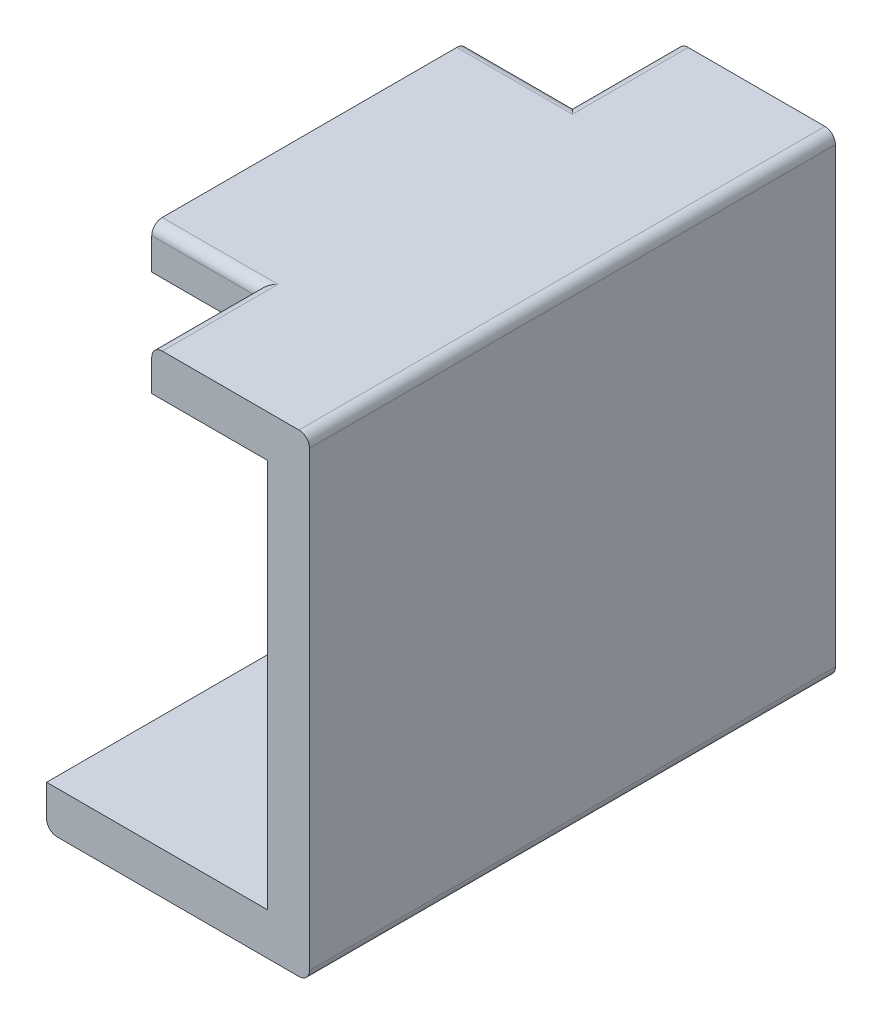
ISO-10303-21;
HEADER;
FILE_DESCRIPTION(('STEP AP214'),'2;1');
FILE_NAME('part.step','',(''),(''),'','','');
FILE_SCHEMA(('AUTOMOTIVE_DESIGN { 1 0 10303 214 1 1 1 1 }'));
ENDSEC;
DATA;
#1=APPLICATION_CONTEXT('core data for automotive mechanical design processes');
#2=APPLICATION_PROTOCOL_DEFINITION('international standard','automotive_design',2000,#1);
#3=PRODUCT_CONTEXT('',#1,'mechanical');
#4=PRODUCT('Part','Part','',(#3));
#5=PRODUCT_RELATED_PRODUCT_CATEGORY('part','',(#4));
#6=PRODUCT_DEFINITION_FORMATION('','',#4);
#7=PRODUCT_DEFINITION_CONTEXT('part definition',#1,'design');
#8=PRODUCT_DEFINITION('design','',#6,#7);
#9=PRODUCT_DEFINITION_SHAPE('','',#8);
#10=(LENGTH_UNIT() NAMED_UNIT(*) SI_UNIT(.MILLI.,.METRE.));
#11=(NAMED_UNIT(*) PLANE_ANGLE_UNIT() SI_UNIT($,.RADIAN.));
#12=(NAMED_UNIT(*) SI_UNIT($,.STERADIAN.) SOLID_ANGLE_UNIT());
#13=UNCERTAINTY_MEASURE_WITH_UNIT(LENGTH_MEASURE(1.E-05),#10,'distance_accuracy_value','');
#14=(GEOMETRIC_REPRESENTATION_CONTEXT(3) GLOBAL_UNCERTAINTY_ASSIGNED_CONTEXT((#13)) GLOBAL_UNIT_ASSIGNED_CONTEXT((#10,
#11,#12)) REPRESENTATION_CONTEXT('',''));
#15=CARTESIAN_POINT('',(0.,0.,0.));
#16=DIRECTION('',(0.,0.,1.));
#17=DIRECTION('',(1.,0.,0.));
#18=AXIS2_PLACEMENT_3D('',#15,#16,#17);
#19=CARTESIAN_POINT('',(4.568,3.4256,2.4852));
#20=DIRECTION('',(0.,-1.,0.));
#21=DIRECTION('',(0.,0.,-1.));
#22=AXIS2_PLACEMENT_3D('',#19,#20,#21);
#23=PLANE('',#22);
#24=DIRECTION('',(-1.,0.,0.));
#25=VECTOR('',#24,1.);
#26=CARTESIAN_POINT('',(4.568,3.4256,1.9852));
#27=LINE('',#26,#25);
#28=CARTESIAN_POINT('',(4.808,3.4256,1.9852));
#29=VERTEX_POINT('',#28);
#30=CARTESIAN_POINT('',(4.678,3.4256,1.9852));
#31=VERTEX_POINT('',#30);
#32=EDGE_CURVE('E11',#29,#31,#27,.T.);
#33=ORIENTED_EDGE('',*,*,#32,.T.);
#34=DIRECTION('',(0.,0.,1.));
#35=VECTOR('',#34,1.);
#36=CARTESIAN_POINT('',(4.678,3.4256,2.4852));
#37=LINE('',#36,#35);
#38=CARTESIAN_POINT('',(4.678,3.4256,2.0952));
#39=VERTEX_POINT('',#38);
#40=EDGE_CURVE('E24',#31,#39,#37,.T.);
#41=ORIENTED_EDGE('',*,*,#40,.T.);
#42=DIRECTION('',(-1.,0.,0.));
#43=VECTOR('',#42,1.);
#44=CARTESIAN_POINT('',(4.568,3.4256,2.0952));
#45=LINE('',#44,#43);
#46=CARTESIAN_POINT('',(4.568,3.4256,2.0952));
#47=VERTEX_POINT('',#46);
#48=EDGE_CURVE('E296',#39,#47,#45,.T.);
#49=ORIENTED_EDGE('',*,*,#48,.T.);
#50=DIRECTION('',(0.,0.,-1.));
#51=VECTOR('',#50,1.);
#52=CARTESIAN_POINT('',(4.568,3.4256,2.4852));
#53=LINE('',#52,#51);
#54=CARTESIAN_POINT('',(4.568,3.4256,2.3752));
#55=VERTEX_POINT('',#54);
#56=EDGE_CURVE('E293',#55,#47,#53,.T.);
#57=ORIENTED_EDGE('',*,*,#56,.F.);
#58=DIRECTION('',(1.,0.,0.));
#59=VECTOR('',#58,1.);
#60=CARTESIAN_POINT('',(4.568,3.4256,2.3752));
#61=LINE('',#60,#59);
#62=CARTESIAN_POINT('',(4.678,3.4256,2.3752));
#63=VERTEX_POINT('',#62);
#64=EDGE_CURVE('E291',#55,#63,#61,.T.);
#65=ORIENTED_EDGE('',*,*,#64,.T.);
#66=DIRECTION('',(0.,0.,1.));
#67=VECTOR('',#66,1.);
#68=CARTESIAN_POINT('',(4.678,3.4256,2.4852));
#69=LINE('',#68,#67);
#70=CARTESIAN_POINT('',(4.678,3.4256,2.4852));
#71=VERTEX_POINT('',#70);
#72=EDGE_CURVE('E173',#63,#71,#69,.T.);
#73=ORIENTED_EDGE('',*,*,#72,.T.);
#74=DIRECTION('',(-1.,0.,0.));
#75=VECTOR('',#74,1.);
#76=CARTESIAN_POINT('',(4.568,3.4256,2.4852));
#77=LINE('',#76,#75);
#78=CARTESIAN_POINT('',(4.808,3.4256,2.4852));
#79=VERTEX_POINT('',#78);
#80=EDGE_CURVE('E287',#79,#71,#77,.T.);
#81=ORIENTED_EDGE('',*,*,#80,.F.);
#82=DIRECTION('',(0.,0.,-1.));
#83=VECTOR('',#82,1.);
#84=CARTESIAN_POINT('',(4.808,3.4256,2.4852));
#85=LINE('',#84,#83);
#86=EDGE_CURVE('E285',#79,#29,#85,.T.);
#87=ORIENTED_EDGE('',*,*,#86,.T.);
#88=EDGE_LOOP('',(#33,#41,#49,#57,#65,#73,#81,#87));
#89=FACE_BOUND('',#88,.T.);
#90=ADVANCED_FACE('F17',(#89),#23,.F.);
#91=CARTESIAN_POINT('',(4.568,3.4256,2.4852));
#92=DIRECTION('',(1.,0.,0.));
#93=DIRECTION('',(0.,0.,-1.));
#94=AXIS2_PLACEMENT_3D('',#91,#92,#93);
#95=PLANE('',#94);
#96=ORIENTED_EDGE('',*,*,#56,.T.);
#97=CARTESIAN_POINT('',(4.568,3.4156,2.0952));
#98=DIRECTION('',(-1.,0.,0.));
#99=DIRECTION('',(0.,0.,-1.));
#100=AXIS2_PLACEMENT_3D('',#97,#98,#99);
#101=CIRCLE('',#100,0.01);
#102=CARTESIAN_POINT('',(4.568,3.4156,2.0852));
#103=VERTEX_POINT('',#102);
#104=EDGE_CURVE('E283',#47,#103,#101,.T.);
#105=ORIENTED_EDGE('',*,*,#104,.T.);
#106=DIRECTION('',(0.,-1.,0.));
#107=VECTOR('',#106,1.);
#108=CARTESIAN_POINT('',(4.568,3.4256,2.0852));
#109=LINE('',#108,#107);
#110=CARTESIAN_POINT('',(4.568,3.3856,2.0852));
#111=VERTEX_POINT('',#110);
#112=EDGE_CURVE('E281',#103,#111,#109,.T.);
#113=ORIENTED_EDGE('',*,*,#112,.T.);
#114=DIRECTION('',(0.,0.,-1.));
#115=VECTOR('',#114,1.);
#116=CARTESIAN_POINT('',(4.568,3.3856,2.4852));
#117=LINE('',#116,#115);
#118=CARTESIAN_POINT('',(4.568,3.3856,2.3852));
#119=VERTEX_POINT('',#118);
#120=EDGE_CURVE('E278',#119,#111,#117,.T.);
#121=ORIENTED_EDGE('',*,*,#120,.F.);
#122=DIRECTION('',(0.,1.,0.));
#123=VECTOR('',#122,1.);
#124=CARTESIAN_POINT('',(4.568,3.4256,2.3852));
#125=LINE('',#124,#123);
#126=CARTESIAN_POINT('',(4.568,3.4156,2.3852));
#127=VERTEX_POINT('',#126);
#128=EDGE_CURVE('E276',#119,#127,#125,.T.);
#129=ORIENTED_EDGE('',*,*,#128,.T.);
#130=CARTESIAN_POINT('',(4.568,3.4156,2.3752));
#131=DIRECTION('',(-1.,0.,0.));
#132=DIRECTION('',(0.,0.,-1.));
#133=AXIS2_PLACEMENT_3D('',#130,#131,#132);
#134=CIRCLE('',#133,0.01);
#135=EDGE_CURVE('E159',#127,#55,#134,.T.);
#136=ORIENTED_EDGE('',*,*,#135,.T.);
#137=EDGE_LOOP('',(#96,#105,#113,#121,#129,#136));
#138=FACE_BOUND('',#137,.T.);
#139=ADVANCED_FACE('F317',(#138),#95,.F.);
#140=CARTESIAN_POINT('',(4.778,3.3856,2.4852));
#141=DIRECTION('',(0.,1.,0.));
#142=DIRECTION('',(-1.,0.,0.));
#143=AXIS2_PLACEMENT_3D('',#140,#141,#142);
#144=PLANE('',#143);
#145=DIRECTION('',(1.,0.,0.));
#146=VECTOR('',#145,1.);
#147=CARTESIAN_POINT('',(3.968,3.3856,2.0852));
#148=LINE('',#147,#146);
#149=CARTESIAN_POINT('',(4.668,3.3856,2.0852));
#150=VERTEX_POINT('',#149);
#151=EDGE_CURVE('E273',#111,#150,#148,.T.);
#152=ORIENTED_EDGE('',*,*,#151,.T.);
#153=DIRECTION('',(0.,0.,-1.));
#154=VECTOR('',#153,1.);
#155=CARTESIAN_POINT('',(4.668,3.3856,1.9852));
#156=LINE('',#155,#154);
#157=CARTESIAN_POINT('',(4.668,3.3856,1.9852));
#158=VERTEX_POINT('',#157);
#159=EDGE_CURVE('E271',#150,#158,#156,.T.);
#160=ORIENTED_EDGE('',*,*,#159,.T.);
#161=DIRECTION('',(1.,0.,0.));
#162=VECTOR('',#161,1.);
#163=CARTESIAN_POINT('',(4.778,3.3856,1.9852));
#164=LINE('',#163,#162);
#165=CARTESIAN_POINT('',(4.778,3.3856,1.9852));
#166=VERTEX_POINT('',#165);
#167=EDGE_CURVE('E269',#158,#166,#164,.T.);
#168=ORIENTED_EDGE('',*,*,#167,.T.);
#169=DIRECTION('',(0.,0.,-1.));
#170=VECTOR('',#169,1.);
#171=CARTESIAN_POINT('',(4.778,3.3856,2.4852));
#172=LINE('',#171,#170);
#173=CARTESIAN_POINT('',(4.778,3.3856,2.4852));
#174=VERTEX_POINT('',#173);
#175=EDGE_CURVE('E266',#174,#166,#172,.T.);
#176=ORIENTED_EDGE('',*,*,#175,.F.);
#177=DIRECTION('',(1.,0.,0.));
#178=VECTOR('',#177,1.);
#179=CARTESIAN_POINT('',(4.778,3.3856,2.4852));
#180=LINE('',#179,#178);
#181=CARTESIAN_POINT('',(4.668,3.3856,2.4852));
#182=VERTEX_POINT('',#181);
#183=EDGE_CURVE('E263',#182,#174,#180,.T.);
#184=ORIENTED_EDGE('',*,*,#183,.F.);
#185=DIRECTION('',(0.,0.,-1.));
#186=VECTOR('',#185,1.);
#187=CARTESIAN_POINT('',(4.668,3.3856,2.4852));
#188=LINE('',#187,#186);
#189=CARTESIAN_POINT('',(4.668,3.3856,2.3852));
#190=VERTEX_POINT('',#189);
#191=EDGE_CURVE('E261',#182,#190,#188,.T.);
#192=ORIENTED_EDGE('',*,*,#191,.T.);
#193=DIRECTION('',(-1.,0.,0.));
#194=VECTOR('',#193,1.);
#195=CARTESIAN_POINT('',(3.968,3.3856,2.3852));
#196=LINE('',#195,#194);
#197=EDGE_CURVE('E145',#190,#119,#196,.T.);
#198=ORIENTED_EDGE('',*,*,#197,.T.);
#199=ORIENTED_EDGE('',*,*,#120,.T.);
#200=EDGE_LOOP('',(#152,#160,#168,#176,#184,#192,#198,#199));
#201=FACE_BOUND('',#200,.T.);
#202=ADVANCED_FACE('F319',(#201),#144,.F.);
#203=CARTESIAN_POINT('',(4.778,3.3856,2.4852));
#204=DIRECTION('',(1.,0.,0.));
#205=DIRECTION('',(0.,0.,-1.));
#206=AXIS2_PLACEMENT_3D('',#203,#204,#205);
#207=PLANE('',#206);
#208=DIRECTION('',(0.,-1.,0.));
#209=VECTOR('',#208,1.);
#210=CARTESIAN_POINT('',(4.778,3.3856,1.9852));
#211=LINE('',#210,#209);
#212=CARTESIAN_POINT('',(4.778,3.0156,1.9852));
#213=VERTEX_POINT('',#212);
#214=EDGE_CURVE('E258',#166,#213,#211,.T.);
#215=ORIENTED_EDGE('',*,*,#214,.T.);
#216=DIRECTION('',(0.,0.,-1.));
#217=VECTOR('',#216,1.);
#218=CARTESIAN_POINT('',(4.778,3.0156,2.4852));
#219=LINE('',#218,#217);
#220=CARTESIAN_POINT('',(4.778,3.0156,2.4852));
#221=VERTEX_POINT('',#220);
#222=EDGE_CURVE('E255',#221,#213,#219,.T.);
#223=ORIENTED_EDGE('',*,*,#222,.F.);
#224=DIRECTION('',(0.,-1.,0.));
#225=VECTOR('',#224,1.);
#226=CARTESIAN_POINT('',(4.778,3.3856,2.4852));
#227=LINE('',#226,#225);
#228=EDGE_CURVE('E252',#174,#221,#227,.T.);
#229=ORIENTED_EDGE('',*,*,#228,.F.);
#230=ORIENTED_EDGE('',*,*,#175,.T.);
#231=EDGE_LOOP('',(#215,#223,#229,#230));
#232=FACE_BOUND('',#231,.T.);
#233=ADVANCED_FACE('F358',(#232),#207,.F.);
#234=CARTESIAN_POINT('',(4.778,3.0156,2.4852));
#235=DIRECTION('',(0.,-1.,0.));
#236=DIRECTION('',(0.,0.,-1.));
#237=AXIS2_PLACEMENT_3D('',#234,#235,#236);
#238=PLANE('',#237);
#239=DIRECTION('',(-1.,0.,0.));
#240=VECTOR('',#239,1.);
#241=CARTESIAN_POINT('',(4.778,3.0156,1.9852));
#242=LINE('',#241,#240);
#243=CARTESIAN_POINT('',(4.568,3.0156,1.9852));
#244=VERTEX_POINT('',#243);
#245=EDGE_CURVE('E250',#213,#244,#242,.T.);
#246=ORIENTED_EDGE('',*,*,#245,.T.);
#247=DIRECTION('',(0.,0.,-1.));
#248=VECTOR('',#247,1.);
#249=CARTESIAN_POINT('',(4.568,3.0156,2.4852));
#250=LINE('',#249,#248);
#251=CARTESIAN_POINT('',(4.568,3.0156,2.4852));
#252=VERTEX_POINT('',#251);
#253=EDGE_CURVE('E247',#252,#244,#250,.T.);
#254=ORIENTED_EDGE('',*,*,#253,.F.);
#255=DIRECTION('',(-1.,0.,0.));
#256=VECTOR('',#255,1.);
#257=CARTESIAN_POINT('',(4.778,3.0156,2.4852));
#258=LINE('',#257,#256);
#259=EDGE_CURVE('E244',#221,#252,#258,.T.);
#260=ORIENTED_EDGE('',*,*,#259,.F.);
#261=ORIENTED_EDGE('',*,*,#222,.T.);
#262=EDGE_LOOP('',(#246,#254,#260,#261));
#263=FACE_BOUND('',#262,.T.);
#264=ADVANCED_FACE('F353',(#263),#238,.F.);
#265=CARTESIAN_POINT('',(4.568,3.0156,2.4852));
#266=DIRECTION('',(1.,0.,0.));
#267=DIRECTION('',(0.,0.,-1.));
#268=AXIS2_PLACEMENT_3D('',#265,#266,#267);
#269=PLANE('',#268);
#270=DIRECTION('',(0.,-1.,0.));
#271=VECTOR('',#270,1.);
#272=CARTESIAN_POINT('',(4.568,3.0156,1.9852));
#273=LINE('',#272,#271);
#274=CARTESIAN_POINT('',(4.568,2.9856,1.9852));
#275=VERTEX_POINT('',#274);
#276=EDGE_CURVE('E242',#244,#275,#273,.T.);
#277=ORIENTED_EDGE('',*,*,#276,.T.);
#278=DIRECTION('',(0.,0.,1.));
#279=VECTOR('',#278,1.);
#280=CARTESIAN_POINT('',(4.568,2.9856,2.4852));
#281=LINE('',#280,#279);
#282=CARTESIAN_POINT('',(4.568,2.9856,2.4852));
#283=VERTEX_POINT('',#282);
#284=EDGE_CURVE('E240',#275,#283,#281,.T.);
#285=ORIENTED_EDGE('',*,*,#284,.T.);
#286=DIRECTION('',(0.,-1.,0.));
#287=VECTOR('',#286,1.);
#288=CARTESIAN_POINT('',(4.568,3.0156,2.4852));
#289=LINE('',#288,#287);
#290=EDGE_CURVE('E237',#252,#283,#289,.T.);
#291=ORIENTED_EDGE('',*,*,#290,.F.);
#292=ORIENTED_EDGE('',*,*,#253,.T.);
#293=EDGE_LOOP('',(#277,#285,#291,#292));
#294=FACE_BOUND('',#293,.T.);
#295=ADVANCED_FACE('F350',(#294),#269,.F.);
#296=CARTESIAN_POINT('',(4.568,2.9756,2.4852));
#297=DIRECTION('',(0.,1.,0.));
#298=DIRECTION('',(-1.,0.,0.));
#299=AXIS2_PLACEMENT_3D('',#296,#297,#298);
#300=PLANE('',#299);
#301=DIRECTION('',(1.,0.,0.));
#302=VECTOR('',#301,1.);
#303=CARTESIAN_POINT('',(4.568,2.9756,2.4852));
#304=LINE('',#303,#302);
#305=CARTESIAN_POINT('',(4.578,2.9756,2.4852));
#306=VERTEX_POINT('',#305);
#307=CARTESIAN_POINT('',(4.808,2.9756,2.4852));
#308=VERTEX_POINT('',#307);
#309=EDGE_CURVE('E235',#306,#308,#304,.T.);
#310=ORIENTED_EDGE('',*,*,#309,.F.);
#311=DIRECTION('',(0.,0.,-1.));
#312=VECTOR('',#311,1.);
#313=CARTESIAN_POINT('',(4.578,2.9756,2.4852));
#314=LINE('',#313,#312);
#315=CARTESIAN_POINT('',(4.578,2.9756,1.9852));
#316=VERTEX_POINT('',#315);
#317=EDGE_CURVE('E233',#306,#316,#314,.T.);
#318=ORIENTED_EDGE('',*,*,#317,.T.);
#319=DIRECTION('',(1.,0.,0.));
#320=VECTOR('',#319,1.);
#321=CARTESIAN_POINT('',(4.568,2.9756,1.9852));
#322=LINE('',#321,#320);
#323=CARTESIAN_POINT('',(4.808,2.9756,1.9852));
#324=VERTEX_POINT('',#323);
#325=EDGE_CURVE('E231',#316,#324,#322,.T.);
#326=ORIENTED_EDGE('',*,*,#325,.T.);
#327=DIRECTION('',(0.,0.,1.));
#328=VECTOR('',#327,1.);
#329=CARTESIAN_POINT('',(4.808,2.9756,2.4852));
#330=LINE('',#329,#328);
#331=EDGE_CURVE('E228',#324,#308,#330,.T.);
#332=ORIENTED_EDGE('',*,*,#331,.T.);
#333=EDGE_LOOP('',(#310,#318,#326,#332));
#334=FACE_BOUND('',#333,.T.);
#335=ADVANCED_FACE('F340',(#334),#300,.F.);
#336=CARTESIAN_POINT('',(4.818,2.9756,2.4852));
#337=DIRECTION('',(-1.,0.,0.));
#338=DIRECTION('',(0.,0.,1.));
#339=AXIS2_PLACEMENT_3D('',#336,#337,#338);
#340=PLANE('',#339);
#341=DIRECTION('',(0.,1.,0.));
#342=VECTOR('',#341,1.);
#343=CARTESIAN_POINT('',(4.818,2.9756,2.4852));
#344=LINE('',#343,#342);
#345=CARTESIAN_POINT('',(4.818,2.9856,2.4852));
#346=VERTEX_POINT('',#345);
#347=CARTESIAN_POINT('',(4.818,3.4156,2.4852));
#348=VERTEX_POINT('',#347);
#349=EDGE_CURVE('E226',#346,#348,#344,.T.);
#350=ORIENTED_EDGE('',*,*,#349,.F.);
#351=DIRECTION('',(0.,0.,-1.));
#352=VECTOR('',#351,1.);
#353=CARTESIAN_POINT('',(4.818,2.9856,2.4852));
#354=LINE('',#353,#352);
#355=CARTESIAN_POINT('',(4.818,2.9856,1.9852));
#356=VERTEX_POINT('',#355);
#357=EDGE_CURVE('E224',#346,#356,#354,.T.);
#358=ORIENTED_EDGE('',*,*,#357,.T.);
#359=DIRECTION('',(0.,1.,0.));
#360=VECTOR('',#359,1.);
#361=CARTESIAN_POINT('',(4.818,2.9756,1.9852));
#362=LINE('',#361,#360);
#363=CARTESIAN_POINT('',(4.818,3.4156,1.9852));
#364=VERTEX_POINT('',#363);
#365=EDGE_CURVE('E222',#356,#364,#362,.T.);
#366=ORIENTED_EDGE('',*,*,#365,.T.);
#367=DIRECTION('',(0.,0.,1.));
#368=VECTOR('',#367,1.);
#369=CARTESIAN_POINT('',(4.818,3.4156,2.4852));
#370=LINE('',#369,#368);
#371=EDGE_CURVE('E219',#364,#348,#370,.T.);
#372=ORIENTED_EDGE('',*,*,#371,.T.);
#373=EDGE_LOOP('',(#350,#358,#366,#372));
#374=FACE_BOUND('',#373,.T.);
#375=ADVANCED_FACE('F413',(#374),#340,.F.);
#376=CARTESIAN_POINT('',(4.318,2.9756,2.4852));
#377=DIRECTION('',(0.,0.,1.));
#378=DIRECTION('',(1.,0.,0.));
#379=AXIS2_PLACEMENT_3D('',#376,#377,#378);
#380=PLANE('',#379);
#381=ORIENTED_EDGE('',*,*,#290,.T.);
#382=CARTESIAN_POINT('',(4.578,2.9856,2.4852));
#383=DIRECTION('',(0.,0.,1.));
#384=DIRECTION('',(1.,0.,0.));
#385=AXIS2_PLACEMENT_3D('',#382,#383,#384);
#386=CIRCLE('',#385,0.00999999999999959);
#387=EDGE_CURVE('E216',#283,#306,#386,.T.);
#388=ORIENTED_EDGE('',*,*,#387,.T.);
#389=ORIENTED_EDGE('',*,*,#309,.T.);
#390=CARTESIAN_POINT('',(4.808,2.9856,2.4852));
#391=DIRECTION('',(0.,0.,1.));
#392=DIRECTION('',(1.,0.,0.));
#393=AXIS2_PLACEMENT_3D('',#390,#391,#392);
#394=CIRCLE('',#393,0.00999999999999959);
#395=EDGE_CURVE('E213',#308,#346,#394,.T.);
#396=ORIENTED_EDGE('',*,*,#395,.T.);
#397=ORIENTED_EDGE('',*,*,#349,.T.);
#398=CARTESIAN_POINT('',(4.808,3.4156,2.4852));
#399=DIRECTION('',(0.,0.,1.));
#400=DIRECTION('',(1.,0.,0.));
#401=AXIS2_PLACEMENT_3D('',#398,#399,#400);
#402=CIRCLE('',#401,0.00999999999999959);
#403=EDGE_CURVE('E210',#348,#79,#402,.T.);
#404=ORIENTED_EDGE('',*,*,#403,.T.);
#405=ORIENTED_EDGE('',*,*,#80,.T.);
#406=CARTESIAN_POINT('',(4.678,3.4156,2.4852));
#407=DIRECTION('',(0.,0.,1.));
#408=DIRECTION('',(1.,0.,0.));
#409=AXIS2_PLACEMENT_3D('',#406,#407,#408);
#410=CIRCLE('',#409,0.00999999999999959);
#411=CARTESIAN_POINT('',(4.668,3.4156,2.4852));
#412=VERTEX_POINT('',#411);
#413=EDGE_CURVE('E208',#71,#412,#410,.T.);
#414=ORIENTED_EDGE('',*,*,#413,.T.);
#415=DIRECTION('',(0.,1.,0.));
#416=VECTOR('',#415,1.);
#417=CARTESIAN_POINT('',(4.668,3.3856,2.4852));
#418=LINE('',#417,#416);
#419=EDGE_CURVE('E166',#182,#412,#418,.T.);
#420=ORIENTED_EDGE('',*,*,#419,.F.);
#421=ORIENTED_EDGE('',*,*,#183,.T.);
#422=ORIENTED_EDGE('',*,*,#228,.T.);
#423=ORIENTED_EDGE('',*,*,#259,.T.);
#424=EDGE_LOOP('',(#381,#388,#389,#396,#397,#404,#405,#414,#420,#421,#422,#423));
#425=FACE_BOUND('',#424,.T.);
#426=ADVANCED_FACE('F321',(#425),#380,.T.);
#427=CARTESIAN_POINT('',(4.318,2.9756,1.9852));
#428=DIRECTION('',(0.,0.,1.));
#429=DIRECTION('',(1.,0.,0.));
#430=AXIS2_PLACEMENT_3D('',#427,#428,#429);
#431=PLANE('',#430);
#432=ORIENTED_EDGE('',*,*,#325,.F.);
#433=CARTESIAN_POINT('',(4.578,2.9856,1.9852));
#434=DIRECTION('',(0.,0.,-1.));
#435=DIRECTION('',(1.,0.,0.));
#436=AXIS2_PLACEMENT_3D('',#433,#434,#435);
#437=CIRCLE('',#436,0.00999999999999959);
#438=EDGE_CURVE('E204',#316,#275,#437,.T.);
#439=ORIENTED_EDGE('',*,*,#438,.T.);
#440=ORIENTED_EDGE('',*,*,#276,.F.);
#441=ORIENTED_EDGE('',*,*,#245,.F.);
#442=ORIENTED_EDGE('',*,*,#214,.F.);
#443=ORIENTED_EDGE('',*,*,#167,.F.);
#444=DIRECTION('',(0.,1.,0.));
#445=VECTOR('',#444,1.);
#446=CARTESIAN_POINT('',(4.668,3.3856,1.9852));
#447=LINE('',#446,#445);
#448=CARTESIAN_POINT('',(4.668,3.4156,1.9852));
#449=VERTEX_POINT('',#448);
#450=EDGE_CURVE('E202',#158,#449,#447,.T.);
#451=ORIENTED_EDGE('',*,*,#450,.T.);
#452=CARTESIAN_POINT('',(4.678,3.4156,1.9852));
#453=DIRECTION('',(0.,0.,-1.));
#454=DIRECTION('',(1.,0.,0.));
#455=AXIS2_PLACEMENT_3D('',#452,#453,#454);
#456=CIRCLE('',#455,0.00999999999999959);
#457=EDGE_CURVE('E200',#449,#31,#456,.T.);
#458=ORIENTED_EDGE('',*,*,#457,.T.);
#459=ORIENTED_EDGE('',*,*,#32,.F.);
#460=CARTESIAN_POINT('',(4.808,3.4156,1.9852));
#461=DIRECTION('',(0.,0.,-1.));
#462=DIRECTION('',(1.,0.,0.));
#463=AXIS2_PLACEMENT_3D('',#460,#461,#462);
#464=CIRCLE('',#463,0.00999999999999959);
#465=EDGE_CURVE('E198',#29,#364,#464,.T.);
#466=ORIENTED_EDGE('',*,*,#465,.T.);
#467=ORIENTED_EDGE('',*,*,#365,.F.);
#468=CARTESIAN_POINT('',(4.808,2.9856,1.9852));
#469=DIRECTION('',(0.,0.,-1.));
#470=DIRECTION('',(1.,0.,0.));
#471=AXIS2_PLACEMENT_3D('',#468,#469,#470);
#472=CIRCLE('',#471,0.00999999999999959);
#473=EDGE_CURVE('E195',#356,#324,#472,.T.);
#474=ORIENTED_EDGE('',*,*,#473,.T.);
#475=EDGE_LOOP('',(#432,#439,#440,#441,#442,#443,#451,#458,#459,#466,#467,#474));
#476=FACE_BOUND('',#475,.T.);
#477=ADVANCED_FACE('F331',(#476),#431,.F.);
#478=CARTESIAN_POINT('',(3.968,3.3856,2.0852));
#479=DIRECTION('',(0.,0.,1.));
#480=DIRECTION('',(1.,0.,0.));
#481=AXIS2_PLACEMENT_3D('',#478,#479,#480);
#482=PLANE('',#481);
#483=ORIENTED_EDGE('',*,*,#112,.F.);
#484=DIRECTION('',(1.,0.,0.));
#485=VECTOR('',#484,1.);
#486=CARTESIAN_POINT('',(3.968,3.4156,2.0852));
#487=LINE('',#486,#485);
#488=CARTESIAN_POINT('',(4.668,3.4156,2.0852));
#489=VERTEX_POINT('',#488);
#490=EDGE_CURVE('E193',#103,#489,#487,.T.);
#491=ORIENTED_EDGE('',*,*,#490,.T.);
#492=DIRECTION('',(0.,1.,0.));
#493=VECTOR('',#492,1.);
#494=CARTESIAN_POINT('',(4.668,3.3856,2.0852));
#495=LINE('',#494,#493);
#496=EDGE_CURVE('E190',#150,#489,#495,.T.);
#497=ORIENTED_EDGE('',*,*,#496,.F.);
#498=ORIENTED_EDGE('',*,*,#151,.F.);
#499=EDGE_LOOP('',(#483,#491,#497,#498));
#500=FACE_BOUND('',#499,.T.);
#501=ADVANCED_FACE('F315',(#500),#482,.F.);
#502=CARTESIAN_POINT('',(4.668,3.3856,1.9852));
#503=DIRECTION('',(1.,0.,0.));
#504=DIRECTION('',(0.,0.,-1.));
#505=AXIS2_PLACEMENT_3D('',#502,#503,#504);
#506=PLANE('',#505);
#507=ORIENTED_EDGE('',*,*,#496,.T.);
#508=DIRECTION('',(0.,0.,-1.));
#509=VECTOR('',#508,1.);
#510=CARTESIAN_POINT('',(4.668,3.4156,1.9852));
#511=LINE('',#510,#509);
#512=EDGE_CURVE('E149',#489,#449,#511,.T.);
#513=ORIENTED_EDGE('',*,*,#512,.T.);
#514=ORIENTED_EDGE('',*,*,#450,.F.);
#515=ORIENTED_EDGE('',*,*,#159,.F.);
#516=EDGE_LOOP('',(#507,#513,#514,#515));
#517=FACE_BOUND('',#516,.T.);
#518=ADVANCED_FACE('F309',(#517),#506,.F.);
#519=CARTESIAN_POINT('',(3.968,3.3856,2.3852));
#520=DIRECTION('',(0.,0.,-1.));
#521=DIRECTION('',(-1.,0.,0.));
#522=AXIS2_PLACEMENT_3D('',#519,#520,#521);
#523=PLANE('',#522);
#524=DIRECTION('',(0.,1.,0.));
#525=VECTOR('',#524,1.);
#526=CARTESIAN_POINT('',(4.668,3.3856,2.3852));
#527=LINE('',#526,#525);
#528=CARTESIAN_POINT('',(4.668,3.4156,2.3852));
#529=VERTEX_POINT('',#528);
#530=EDGE_CURVE('E139',#190,#529,#527,.T.);
#531=ORIENTED_EDGE('',*,*,#530,.T.);
#532=DIRECTION('',(-1.,0.,0.));
#533=VECTOR('',#532,1.);
#534=CARTESIAN_POINT('',(3.968,3.4156,2.3852));
#535=LINE('',#534,#533);
#536=EDGE_CURVE('E143',#529,#127,#535,.T.);
#537=ORIENTED_EDGE('',*,*,#536,.T.);
#538=ORIENTED_EDGE('',*,*,#128,.F.);
#539=ORIENTED_EDGE('',*,*,#197,.F.);
#540=EDGE_LOOP('',(#531,#537,#538,#539));
#541=FACE_BOUND('',#540,.T.);
#542=ADVANCED_FACE('F141',(#541),#523,.F.);
#543=CARTESIAN_POINT('',(4.668,3.3856,2.4852));
#544=DIRECTION('',(1.,0.,0.));
#545=DIRECTION('',(0.,0.,-1.));
#546=AXIS2_PLACEMENT_3D('',#543,#544,#545);
#547=PLANE('',#546);
#548=ORIENTED_EDGE('',*,*,#419,.T.);
#549=DIRECTION('',(0.,0.,-1.));
#550=VECTOR('',#549,1.);
#551=CARTESIAN_POINT('',(4.668,3.4156,2.4852));
#552=LINE('',#551,#550);
#553=EDGE_CURVE('E160',#412,#529,#552,.T.);
#554=ORIENTED_EDGE('',*,*,#553,.T.);
#555=ORIENTED_EDGE('',*,*,#530,.F.);
#556=ORIENTED_EDGE('',*,*,#191,.F.);
#557=EDGE_LOOP('',(#548,#554,#555,#556));
#558=FACE_BOUND('',#557,.T.);
#559=ADVANCED_FACE('F164',(#558),#547,.F.);
#560=CARTESIAN_POINT('',(4.578,2.9856,2.4852));
#561=DIRECTION('',(0.,0.,-1.));
#562=DIRECTION('',(-1.,0.,0.));
#563=AXIS2_PLACEMENT_3D('',#560,#561,#562);
#564=CYLINDRICAL_SURFACE('',#563,0.00999999999999959);
#565=ORIENTED_EDGE('',*,*,#387,.F.);
#566=ORIENTED_EDGE('',*,*,#284,.F.);
#567=ORIENTED_EDGE('',*,*,#438,.F.);
#568=ORIENTED_EDGE('',*,*,#317,.F.);
#569=EDGE_LOOP('',(#565,#566,#567,#568));
#570=FACE_BOUND('',#569,.T.);
#571=ADVANCED_FACE('F347',(#570),#564,.T.);
#572=CARTESIAN_POINT('',(4.808,2.9856,2.4852));
#573=DIRECTION('',(0.,0.,-1.));
#574=DIRECTION('',(-1.,0.,0.));
#575=AXIS2_PLACEMENT_3D('',#572,#573,#574);
#576=CYLINDRICAL_SURFACE('',#575,0.00999999999999959);
#577=ORIENTED_EDGE('',*,*,#395,.F.);
#578=ORIENTED_EDGE('',*,*,#331,.F.);
#579=ORIENTED_EDGE('',*,*,#473,.F.);
#580=ORIENTED_EDGE('',*,*,#357,.F.);
#581=EDGE_LOOP('',(#577,#578,#579,#580));
#582=FACE_BOUND('',#581,.T.);
#583=ADVANCED_FACE('F338',(#582),#576,.T.);
#584=CARTESIAN_POINT('',(3.968,3.4156,2.0952));
#585=DIRECTION('',(1.,0.,0.));
#586=DIRECTION('',(0.,0.,-1.));
#587=AXIS2_PLACEMENT_3D('',#584,#585,#586);
#588=CYLINDRICAL_SURFACE('',#587,0.01);
#589=ORIENTED_EDGE('',*,*,#104,.F.);
#590=ORIENTED_EDGE('',*,*,#48,.F.);
#591=CARTESIAN_POINT('',(4.668,3.4156,2.0852));
#592=CARTESIAN_POINT('',(4.66799999999996,3.42145786437628,2.08519999999997));
#593=CARTESIAN_POINT('',(4.67214213562377,3.42559999999997,2.08934213562378));
#594=CARTESIAN_POINT('',(4.678,3.4256,2.0952));
#595=(BOUNDED_CURVE() B_SPLINE_CURVE(3,(#591,#592,#593,#594),.UNSPECIFIED.,.F.,
.F.) B_SPLINE_CURVE_WITH_KNOTS((4,4),(0.,1.5707963267949),
.UNSPECIFIED.) CURVE() GEOMETRIC_REPRESENTATION_ITEM() RATIONAL_B_SPLINE_CURVE((1.,
0.804737854124365,0.804737854124365,1.)) REPRESENTATION_ITEM(''));
#596=EDGE_CURVE('E169',#489,#39,#595,.T.);
#597=ORIENTED_EDGE('',*,*,#596,.F.);
#598=ORIENTED_EDGE('',*,*,#490,.F.);
#599=EDGE_LOOP('',(#589,#590,#597,#598));
#600=FACE_BOUND('',#599,.T.);
#601=ADVANCED_FACE('F303',(#600),#588,.T.);
#602=CARTESIAN_POINT('',(4.678,3.4156,1.9852));
#603=DIRECTION('',(0.,0.,-1.));
#604=DIRECTION('',(-1.,0.,0.));
#605=AXIS2_PLACEMENT_3D('',#602,#603,#604);
#606=CYLINDRICAL_SURFACE('',#605,0.00999999999999959);
#607=ORIENTED_EDGE('',*,*,#596,.T.);
#608=ORIENTED_EDGE('',*,*,#40,.F.);
#609=ORIENTED_EDGE('',*,*,#457,.F.);
#610=ORIENTED_EDGE('',*,*,#512,.F.);
#611=EDGE_LOOP('',(#607,#608,#609,#610));
#612=FACE_BOUND('',#611,.T.);
#613=ADVANCED_FACE('F306',(#612),#606,.T.);
#614=CARTESIAN_POINT('',(4.678,3.4156,2.4852));
#615=DIRECTION('',(0.,0.,-1.));
#616=DIRECTION('',(-1.,0.,0.));
#617=AXIS2_PLACEMENT_3D('',#614,#615,#616);
#618=CYLINDRICAL_SURFACE('',#617,0.00999999999999959);
#619=ORIENTED_EDGE('',*,*,#413,.F.);
#620=ORIENTED_EDGE('',*,*,#72,.F.);
#621=CARTESIAN_POINT('',(4.668,3.4156,2.3852));
#622=CARTESIAN_POINT('',(4.66799999999996,3.42145786437628,2.38519999999996));
#623=CARTESIAN_POINT('',(4.67214213562377,3.42559999999997,2.38105786437627));
#624=CARTESIAN_POINT('',(4.678,3.4256,2.3752));
#625=(BOUNDED_CURVE() B_SPLINE_CURVE(3,(#621,#622,#623,#624),.UNSPECIFIED.,.F.,
.F.) B_SPLINE_CURVE_WITH_KNOTS((4,4),(0.,1.5707963267949),
.UNSPECIFIED.) CURVE() GEOMETRIC_REPRESENTATION_ITEM() RATIONAL_B_SPLINE_CURVE((1.,
0.804737854124365,0.804737854124365,1.)) REPRESENTATION_ITEM(''));
#626=EDGE_CURVE('E157',#529,#63,#625,.T.);
#627=ORIENTED_EDGE('',*,*,#626,.F.);
#628=ORIENTED_EDGE('',*,*,#553,.F.);
#629=EDGE_LOOP('',(#619,#620,#627,#628));
#630=FACE_BOUND('',#629,.T.);
#631=ADVANCED_FACE('F172',(#630),#618,.T.);
#632=CARTESIAN_POINT('',(3.968,3.4156,2.3752));
#633=DIRECTION('',(-1.,0.,0.));
#634=DIRECTION('',(0.,0.,1.));
#635=AXIS2_PLACEMENT_3D('',#632,#633,#634);
#636=CYLINDRICAL_SURFACE('',#635,0.01);
#637=ORIENTED_EDGE('',*,*,#626,.T.);
#638=ORIENTED_EDGE('',*,*,#64,.F.);
#639=ORIENTED_EDGE('',*,*,#135,.F.);
#640=ORIENTED_EDGE('',*,*,#536,.F.);
#641=EDGE_LOOP('',(#637,#638,#639,#640));
#642=FACE_BOUND('',#641,.T.);
#643=ADVANCED_FACE('F154',(#642),#636,.T.);
#644=CARTESIAN_POINT('',(4.808,3.4156,2.4852));
#645=DIRECTION('',(0.,0.,-1.));
#646=DIRECTION('',(-1.,0.,0.));
#647=AXIS2_PLACEMENT_3D('',#644,#645,#646);
#648=CYLINDRICAL_SURFACE('',#647,0.00999999999999959);
#649=ORIENTED_EDGE('',*,*,#403,.F.);
#650=ORIENTED_EDGE('',*,*,#371,.F.);
#651=ORIENTED_EDGE('',*,*,#465,.F.);
#652=ORIENTED_EDGE('',*,*,#86,.F.);
#653=EDGE_LOOP('',(#649,#650,#651,#652));
#654=FACE_BOUND('',#653,.T.);
#655=ADVANCED_FACE('F327',(#654),#648,.T.);
#656=CLOSED_SHELL('',(#90,#139,#202,#233,#264,#295,#335,#375,#426,#477,#501,#518,#542,#559,#571,
#583,#601,#613,#631,#643,#655));
#657=MANIFOLD_SOLID_BREP('B1',#656);
#658=ADVANCED_BREP_SHAPE_REPRESENTATION('',(#18,#657),#14);
#659=SHAPE_DEFINITION_REPRESENTATION(#9,#658);
ENDSEC;
END-ISO-10303-21;
